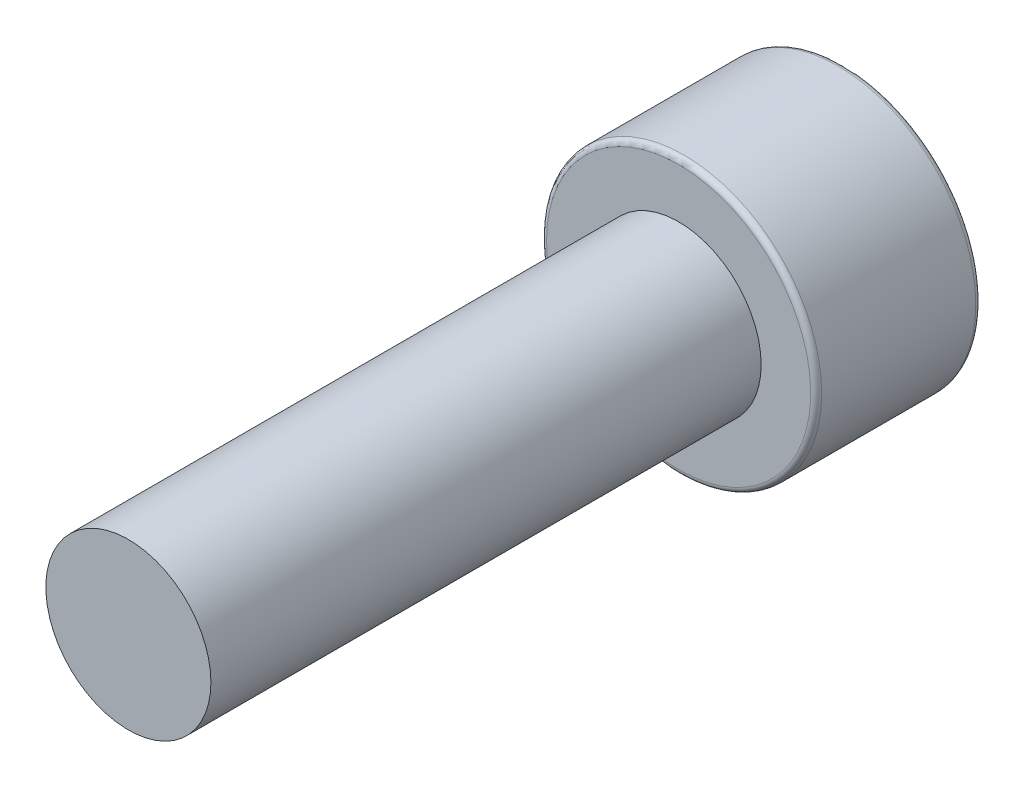
ISO-10303-21;
HEADER;
FILE_DESCRIPTION(('STEP AP214'),'2;1');
FILE_NAME('part.step','',(''),(''),'','','');
FILE_SCHEMA(('AUTOMOTIVE_DESIGN { 1 0 10303 214 1 1 1 1 }'));
ENDSEC;
DATA;
#1=APPLICATION_CONTEXT('core data for automotive mechanical design processes');
#2=APPLICATION_PROTOCOL_DEFINITION('international standard','automotive_design',2000,#1);
#3=PRODUCT_CONTEXT('',#1,'mechanical');
#4=PRODUCT('Part','Part','',(#3));
#5=PRODUCT_RELATED_PRODUCT_CATEGORY('part','',(#4));
#6=PRODUCT_DEFINITION_FORMATION('','',#4);
#7=PRODUCT_DEFINITION_CONTEXT('part definition',#1,'design');
#8=PRODUCT_DEFINITION('design','',#6,#7);
#9=PRODUCT_DEFINITION_SHAPE('','',#8);
#10=(LENGTH_UNIT() NAMED_UNIT(*) SI_UNIT(.MILLI.,.METRE.));
#11=(NAMED_UNIT(*) PLANE_ANGLE_UNIT() SI_UNIT($,.RADIAN.));
#12=(NAMED_UNIT(*) SI_UNIT($,.STERADIAN.) SOLID_ANGLE_UNIT());
#13=UNCERTAINTY_MEASURE_WITH_UNIT(LENGTH_MEASURE(1.E-05),#10,'distance_accuracy_value','');
#14=(GEOMETRIC_REPRESENTATION_CONTEXT(3) GLOBAL_UNCERTAINTY_ASSIGNED_CONTEXT((#13)) GLOBAL_UNIT_ASSIGNED_CONTEXT((#10,
#11,#12)) REPRESENTATION_CONTEXT('',''));
#15=CARTESIAN_POINT('',(0.,0.,0.));
#16=DIRECTION('',(0.,0.,1.));
#17=DIRECTION('',(1.,0.,0.));
#18=AXIS2_PLACEMENT_3D('',#15,#16,#17);
#19=CARTESIAN_POINT('',(0.,0.,10.));
#20=DIRECTION('',(0.,0.,-1.));
#21=DIRECTION('',(-1.,0.,0.));
#22=AXIS2_PLACEMENT_3D('',#19,#20,#21);
#23=CYLINDRICAL_SURFACE('',#22,1.5);
#24=CARTESIAN_POINT('',(0.,0.,10.));
#25=DIRECTION('',(0.,0.,1.));
#26=DIRECTION('',(1.,0.,0.));
#27=AXIS2_PLACEMENT_3D('',#24,#25,#26);
#28=CIRCLE('',#27,1.5);
#29=CARTESIAN_POINT('',(1.5,0.,10.));
#30=VERTEX_POINT('',#29);
#31=EDGE_CURVE('E164',#30,#30,#28,.T.);
#32=ORIENTED_EDGE('',*,*,#31,.F.);
#33=EDGE_LOOP('',(#32));
#34=FACE_BOUND('',#33,.T.);
#35=CARTESIAN_POINT('',(0.,0.,0.));
#36=DIRECTION('',(0.,0.,1.));
#37=DIRECTION('',(1.,0.,0.));
#38=AXIS2_PLACEMENT_3D('',#35,#36,#37);
#39=CIRCLE('',#38,1.5);
#40=CARTESIAN_POINT('',(1.5,0.,0.));
#41=VERTEX_POINT('',#40);
#42=EDGE_CURVE('E154',#41,#41,#39,.T.);
#43=ORIENTED_EDGE('',*,*,#42,.T.);
#44=EDGE_LOOP('',(#43));
#45=FACE_BOUND('',#44,.T.);
#46=ADVANCED_FACE('F39',(#34,#45),#23,.T.);
#47=CARTESIAN_POINT('',(0.,0.,10.));
#48=DIRECTION('',(0.,0.,1.));
#49=DIRECTION('',(1.,0.,0.));
#50=AXIS2_PLACEMENT_3D('',#47,#48,#49);
#51=PLANE('',#50);
#52=ORIENTED_EDGE('',*,*,#31,.T.);
#53=EDGE_LOOP('',(#52));
#54=FACE_BOUND('',#53,.T.);
#55=ADVANCED_FACE('F194',(#54),#51,.T.);
#56=CARTESIAN_POINT('',(0.,0.,-3.));
#57=DIRECTION('',(0.,0.,1.));
#58=DIRECTION('',(1.,0.,0.));
#59=AXIS2_PLACEMENT_3D('',#56,#57,#58);
#60=CYLINDRICAL_SURFACE('',#59,2.5);
#61=CARTESIAN_POINT('',(0.,0.,-0.0999999999999998));
#62=DIRECTION('',(0.,0.,-1.));
#63=DIRECTION('',(-1.,0.,0.));
#64=AXIS2_PLACEMENT_3D('',#61,#62,#63);
#65=CIRCLE('',#64,2.5);
#66=CARTESIAN_POINT('',(-2.5,0.,-0.0999999999999998));
#67=VERTEX_POINT('',#66);
#68=EDGE_CURVE('E48',#67,#67,#65,.T.);
#69=ORIENTED_EDGE('',*,*,#68,.T.);
#70=EDGE_LOOP('',(#69));
#71=FACE_BOUND('',#70,.T.);
#72=CARTESIAN_POINT('',(0.,0.,-2.9));
#73=DIRECTION('',(0.,0.,-1.));
#74=DIRECTION('',(-1.,0.,0.));
#75=AXIS2_PLACEMENT_3D('',#72,#73,#74);
#76=CIRCLE('',#75,2.5);
#77=CARTESIAN_POINT('',(-2.5,0.,-2.9));
#78=VERTEX_POINT('',#77);
#79=EDGE_CURVE('E175',#78,#78,#76,.F.);
#80=ORIENTED_EDGE('',*,*,#79,.T.);
#81=EDGE_LOOP('',(#80));
#82=FACE_BOUND('',#81,.T.);
#83=ADVANCED_FACE('F182',(#71,#82),#60,.T.);
#84=CARTESIAN_POINT('',(0.,0.,-3.));
#85=DIRECTION('',(0.,0.,-1.));
#86=DIRECTION('',(-1.,0.,0.));
#87=AXIS2_PLACEMENT_3D('',#84,#85,#86);
#88=PLANE('',#87);
#89=CARTESIAN_POINT('',(0.,0.,-3.));
#90=DIRECTION('',(0.,0.,-1.));
#91=DIRECTION('',(-1.,0.,0.));
#92=AXIS2_PLACEMENT_3D('',#89,#90,#91);
#93=CIRCLE('',#92,2.4);
#94=CARTESIAN_POINT('',(-2.4,0.,-3.));
#95=VERTEX_POINT('',#94);
#96=EDGE_CURVE('E168',#95,#95,#93,.T.);
#97=ORIENTED_EDGE('',*,*,#96,.T.);
#98=EDGE_LOOP('',(#97));
#99=FACE_BOUND('',#98,.T.);
#100=DIRECTION('',(-0.5,0.866025403784439,0.));
#101=VECTOR('',#100,1.);
#102=CARTESIAN_POINT('',(-0.75,-1.29903810567666,-3.));
#103=LINE('',#102,#101);
#104=CARTESIAN_POINT('',(-0.75,-1.29903810567666,-3.));
#105=VERTEX_POINT('',#104);
#106=CARTESIAN_POINT('',(-1.5,0.,-3.));
#107=VERTEX_POINT('',#106);
#108=EDGE_CURVE('E55',#105,#107,#103,.T.);
#109=ORIENTED_EDGE('',*,*,#108,.F.);
#110=DIRECTION('',(-1.,0.,0.));
#111=VECTOR('',#110,1.);
#112=CARTESIAN_POINT('',(0.75,-1.29903810567666,-3.));
#113=LINE('',#112,#111);
#114=CARTESIAN_POINT('',(0.75,-1.29903810567666,-3.));
#115=VERTEX_POINT('',#114);
#116=EDGE_CURVE('E148',#115,#105,#113,.T.);
#117=ORIENTED_EDGE('',*,*,#116,.F.);
#118=DIRECTION('',(-0.5,-0.866025403784439,0.));
#119=VECTOR('',#118,1.);
#120=CARTESIAN_POINT('',(1.5,0.,-3.));
#121=LINE('',#120,#119);
#122=CARTESIAN_POINT('',(1.5,0.,-3.));
#123=VERTEX_POINT('',#122);
#124=EDGE_CURVE('E145',#123,#115,#121,.T.);
#125=ORIENTED_EDGE('',*,*,#124,.F.);
#126=DIRECTION('',(0.5,-0.866025403784439,0.));
#127=VECTOR('',#126,1.);
#128=CARTESIAN_POINT('',(0.75,1.29903810567666,-3.));
#129=LINE('',#128,#127);
#130=CARTESIAN_POINT('',(0.75,1.29903810567666,-3.));
#131=VERTEX_POINT('',#130);
#132=EDGE_CURVE('E103',#131,#123,#129,.T.);
#133=ORIENTED_EDGE('',*,*,#132,.F.);
#134=DIRECTION('',(1.,0.,0.));
#135=VECTOR('',#134,1.);
#136=CARTESIAN_POINT('',(-0.749999999999999,1.29903810567666,-3.));
#137=LINE('',#136,#135);
#138=CARTESIAN_POINT('',(-0.749999999999999,1.29903810567666,-3.));
#139=VERTEX_POINT('',#138);
#140=EDGE_CURVE('E139',#139,#131,#137,.T.);
#141=ORIENTED_EDGE('',*,*,#140,.F.);
#142=DIRECTION('',(0.5,0.866025403784439,0.));
#143=VECTOR('',#142,1.);
#144=CARTESIAN_POINT('',(-1.5,0.,-3.));
#145=LINE('',#144,#143);
#146=EDGE_CURVE('E135',#107,#139,#145,.T.);
#147=ORIENTED_EDGE('',*,*,#146,.F.);
#148=EDGE_LOOP('',(#109,#117,#125,#133,#141,#147));
#149=FACE_BOUND('',#148,.T.);
#150=ADVANCED_FACE('F207',(#99,#149),#88,.T.);
#151=CARTESIAN_POINT('',(0.,0.,0.));
#152=DIRECTION('',(0.,0.,-1.));
#153=DIRECTION('',(-1.,0.,0.));
#154=AXIS2_PLACEMENT_3D('',#151,#152,#153);
#155=PLANE('',#154);
#156=CARTESIAN_POINT('',(0.,0.,0.));
#157=DIRECTION('',(0.,0.,-1.));
#158=DIRECTION('',(-1.,0.,0.));
#159=AXIS2_PLACEMENT_3D('',#156,#157,#158);
#160=CIRCLE('',#159,2.4);
#161=CARTESIAN_POINT('',(-2.4,0.,0.));
#162=VERTEX_POINT('',#161);
#163=EDGE_CURVE('E11',#162,#162,#160,.F.);
#164=ORIENTED_EDGE('',*,*,#163,.T.);
#165=EDGE_LOOP('',(#164));
#166=FACE_BOUND('',#165,.T.);
#167=ORIENTED_EDGE('',*,*,#42,.F.);
#168=EDGE_LOOP('',(#167));
#169=FACE_BOUND('',#168,.T.);
#170=ADVANCED_FACE('F208',(#166,#169),#155,.F.);
#171=CARTESIAN_POINT('',(-0.75,-1.29903810567666,-0.5));
#172=DIRECTION('',(-0.866025403784439,-0.5,0.));
#173=DIRECTION('',(0.5,-0.866025403784439,0.));
#174=AXIS2_PLACEMENT_3D('',#171,#172,#173);
#175=PLANE('',#174);
#176=ORIENTED_EDGE('',*,*,#108,.T.);
#177=DIRECTION('',(0.,0.,-1.));
#178=VECTOR('',#177,1.);
#179=CARTESIAN_POINT('',(-1.5,0.,-0.5));
#180=LINE('',#179,#178);
#181=CARTESIAN_POINT('',(-1.5,0.,-0.5));
#182=VERTEX_POINT('',#181);
#183=EDGE_CURVE('E85',#182,#107,#180,.T.);
#184=ORIENTED_EDGE('',*,*,#183,.F.);
#185=DIRECTION('',(-0.5,0.866025403784439,0.));
#186=VECTOR('',#185,1.);
#187=CARTESIAN_POINT('',(-0.75,-1.29903810567666,-0.5));
#188=LINE('',#187,#186);
#189=CARTESIAN_POINT('',(-0.75,-1.29903810567666,-0.5));
#190=VERTEX_POINT('',#189);
#191=EDGE_CURVE('E151',#190,#182,#188,.T.);
#192=ORIENTED_EDGE('',*,*,#191,.F.);
#193=DIRECTION('',(0.,0.,-1.));
#194=VECTOR('',#193,1.);
#195=CARTESIAN_POINT('',(-0.75,-1.29903810567666,-0.5));
#196=LINE('',#195,#194);
#197=EDGE_CURVE('E63',#190,#105,#196,.T.);
#198=ORIENTED_EDGE('',*,*,#197,.T.);
#199=EDGE_LOOP('',(#176,#184,#192,#198));
#200=FACE_BOUND('',#199,.T.);
#201=ADVANCED_FACE('F211',(#200),#175,.F.);
#202=CARTESIAN_POINT('',(0.75,-1.29903810567666,-0.5));
#203=DIRECTION('',(0.,-1.,0.));
#204=DIRECTION('',(1.,0.,0.));
#205=AXIS2_PLACEMENT_3D('',#202,#203,#204);
#206=PLANE('',#205);
#207=ORIENTED_EDGE('',*,*,#116,.T.);
#208=ORIENTED_EDGE('',*,*,#197,.F.);
#209=DIRECTION('',(-1.,0.,0.));
#210=VECTOR('',#209,1.);
#211=CARTESIAN_POINT('',(0.75,-1.29903810567666,-0.5));
#212=LINE('',#211,#210);
#213=CARTESIAN_POINT('',(0.75,-1.29903810567666,-0.5));
#214=VERTEX_POINT('',#213);
#215=EDGE_CURVE('E117',#214,#190,#212,.T.);
#216=ORIENTED_EDGE('',*,*,#215,.F.);
#217=DIRECTION('',(0.,0.,-1.));
#218=VECTOR('',#217,1.);
#219=CARTESIAN_POINT('',(0.75,-1.29903810567666,-0.5));
#220=LINE('',#219,#218);
#221=EDGE_CURVE('E108',#214,#115,#220,.T.);
#222=ORIENTED_EDGE('',*,*,#221,.T.);
#223=EDGE_LOOP('',(#207,#208,#216,#222));
#224=FACE_BOUND('',#223,.T.);
#225=ADVANCED_FACE('F218',(#224),#206,.F.);
#226=CARTESIAN_POINT('',(1.5,0.,-0.5));
#227=DIRECTION('',(0.866025403784439,-0.5,0.));
#228=DIRECTION('',(0.5,0.866025403784439,0.));
#229=AXIS2_PLACEMENT_3D('',#226,#227,#228);
#230=PLANE('',#229);
#231=ORIENTED_EDGE('',*,*,#124,.T.);
#232=ORIENTED_EDGE('',*,*,#221,.F.);
#233=DIRECTION('',(-0.5,-0.866025403784439,0.));
#234=VECTOR('',#233,1.);
#235=CARTESIAN_POINT('',(1.5,0.,-0.5));
#236=LINE('',#235,#234);
#237=CARTESIAN_POINT('',(1.5,0.,-0.5));
#238=VERTEX_POINT('',#237);
#239=EDGE_CURVE('E112',#238,#214,#236,.T.);
#240=ORIENTED_EDGE('',*,*,#239,.F.);
#241=DIRECTION('',(0.,0.,-1.));
#242=VECTOR('',#241,1.);
#243=CARTESIAN_POINT('',(1.5,0.,-0.5));
#244=LINE('',#243,#242);
#245=EDGE_CURVE('E96',#238,#123,#244,.T.);
#246=ORIENTED_EDGE('',*,*,#245,.T.);
#247=EDGE_LOOP('',(#231,#232,#240,#246));
#248=FACE_BOUND('',#247,.T.);
#249=ADVANCED_FACE('F113',(#248),#230,.F.);
#250=CARTESIAN_POINT('',(0.75,1.29903810567666,-0.5));
#251=DIRECTION('',(0.866025403784439,0.5,0.));
#252=DIRECTION('',(-0.5,0.866025403784439,0.));
#253=AXIS2_PLACEMENT_3D('',#250,#251,#252);
#254=PLANE('',#253);
#255=ORIENTED_EDGE('',*,*,#132,.T.);
#256=ORIENTED_EDGE('',*,*,#245,.F.);
#257=DIRECTION('',(0.5,-0.866025403784439,0.));
#258=VECTOR('',#257,1.);
#259=CARTESIAN_POINT('',(0.75,1.29903810567666,-0.5));
#260=LINE('',#259,#258);
#261=CARTESIAN_POINT('',(0.75,1.29903810567666,-0.5));
#262=VERTEX_POINT('',#261);
#263=EDGE_CURVE('E100',#262,#238,#260,.T.);
#264=ORIENTED_EDGE('',*,*,#263,.F.);
#265=DIRECTION('',(0.,0.,-1.));
#266=VECTOR('',#265,1.);
#267=CARTESIAN_POINT('',(0.75,1.29903810567666,-0.5));
#268=LINE('',#267,#266);
#269=EDGE_CURVE('E109',#262,#131,#268,.T.);
#270=ORIENTED_EDGE('',*,*,#269,.T.);
#271=EDGE_LOOP('',(#255,#256,#264,#270));
#272=FACE_BOUND('',#271,.T.);
#273=ADVANCED_FACE('F98',(#272),#254,.F.);
#274=CARTESIAN_POINT('',(-0.749999999999999,1.29903810567666,-0.5));
#275=DIRECTION('',(0.,1.,0.));
#276=DIRECTION('',(-1.,0.,0.));
#277=AXIS2_PLACEMENT_3D('',#274,#275,#276);
#278=PLANE('',#277);
#279=ORIENTED_EDGE('',*,*,#140,.T.);
#280=ORIENTED_EDGE('',*,*,#269,.F.);
#281=DIRECTION('',(1.,0.,0.));
#282=VECTOR('',#281,1.);
#283=CARTESIAN_POINT('',(-0.749999999999999,1.29903810567666,-0.5));
#284=LINE('',#283,#282);
#285=CARTESIAN_POINT('',(-0.749999999999999,1.29903810567666,-0.5));
#286=VERTEX_POINT('',#285);
#287=EDGE_CURVE('E123',#286,#262,#284,.T.);
#288=ORIENTED_EDGE('',*,*,#287,.F.);
#289=DIRECTION('',(0.,0.,-1.));
#290=VECTOR('',#289,1.);
#291=CARTESIAN_POINT('',(-0.749999999999999,1.29903810567666,-0.5));
#292=LINE('',#291,#290);
#293=EDGE_CURVE('E159',#286,#139,#292,.T.);
#294=ORIENTED_EDGE('',*,*,#293,.T.);
#295=EDGE_LOOP('',(#279,#280,#288,#294));
#296=FACE_BOUND('',#295,.T.);
#297=ADVANCED_FACE('F222',(#296),#278,.F.);
#298=CARTESIAN_POINT('',(-1.5,0.,-0.5));
#299=DIRECTION('',(-0.866025403784439,0.5,0.));
#300=DIRECTION('',(-0.5,-0.866025403784439,0.));
#301=AXIS2_PLACEMENT_3D('',#298,#299,#300);
#302=PLANE('',#301);
#303=ORIENTED_EDGE('',*,*,#146,.T.);
#304=ORIENTED_EDGE('',*,*,#293,.F.);
#305=DIRECTION('',(0.5,0.866025403784439,0.));
#306=VECTOR('',#305,1.);
#307=CARTESIAN_POINT('',(-1.5,0.,-0.5));
#308=LINE('',#307,#306);
#309=EDGE_CURVE('E127',#182,#286,#308,.T.);
#310=ORIENTED_EDGE('',*,*,#309,.F.);
#311=ORIENTED_EDGE('',*,*,#183,.T.);
#312=EDGE_LOOP('',(#303,#304,#310,#311));
#313=FACE_BOUND('',#312,.T.);
#314=ADVANCED_FACE('F219',(#313),#302,.F.);
#315=CARTESIAN_POINT('',(0.,0.,-0.5));
#316=DIRECTION('',(0.,0.,-1.));
#317=DIRECTION('',(-1.,0.,0.));
#318=AXIS2_PLACEMENT_3D('',#315,#316,#317);
#319=PLANE('',#318);
#320=ORIENTED_EDGE('',*,*,#191,.T.);
#321=ORIENTED_EDGE('',*,*,#309,.T.);
#322=ORIENTED_EDGE('',*,*,#287,.T.);
#323=ORIENTED_EDGE('',*,*,#263,.T.);
#324=ORIENTED_EDGE('',*,*,#239,.T.);
#325=ORIENTED_EDGE('',*,*,#215,.T.);
#326=EDGE_LOOP('',(#320,#321,#322,#323,#324,#325));
#327=FACE_BOUND('',#326,.T.);
#328=ADVANCED_FACE('F120',(#327),#319,.T.);
#329=CARTESIAN_POINT('',(0.,0.,-2.9));
#330=DIRECTION('',(0.,0.,-1.));
#331=DIRECTION('',(-1.,0.,0.));
#332=AXIS2_PLACEMENT_3D('',#329,#330,#331);
#333=TOROIDAL_SURFACE('',#332,2.4,0.1);
#334=ORIENTED_EDGE('',*,*,#79,.F.);
#335=EDGE_LOOP('',(#334));
#336=FACE_BOUND('',#335,.T.);
#337=ORIENTED_EDGE('',*,*,#96,.F.);
#338=EDGE_LOOP('',(#337));
#339=FACE_BOUND('',#338,.T.);
#340=ADVANCED_FACE('F186',(#336,#339),#333,.T.);
#341=CARTESIAN_POINT('',(0.,0.,-0.0999999999999998));
#342=DIRECTION('',(0.,0.,-1.));
#343=DIRECTION('',(-1.,0.,0.));
#344=AXIS2_PLACEMENT_3D('',#341,#342,#343);
#345=TOROIDAL_SURFACE('',#344,2.4,0.1);
#346=ORIENTED_EDGE('',*,*,#163,.F.);
#347=EDGE_LOOP('',(#346));
#348=FACE_BOUND('',#347,.T.);
#349=ORIENTED_EDGE('',*,*,#68,.F.);
#350=EDGE_LOOP('',(#349));
#351=FACE_BOUND('',#350,.T.);
#352=ADVANCED_FACE('F41',(#348,#351),#345,.T.);
#353=CLOSED_SHELL('',(#46,#55,#83,#150,#170,#201,#225,#249,#273,#297,#314,#328,#340,#352));
#354=MANIFOLD_SOLID_BREP('B2',#353);
#355=ADVANCED_BREP_SHAPE_REPRESENTATION('',(#18,#354),#14);
#356=SHAPE_DEFINITION_REPRESENTATION(#9,#355);
ENDSEC;
END-ISO-10303-21;
